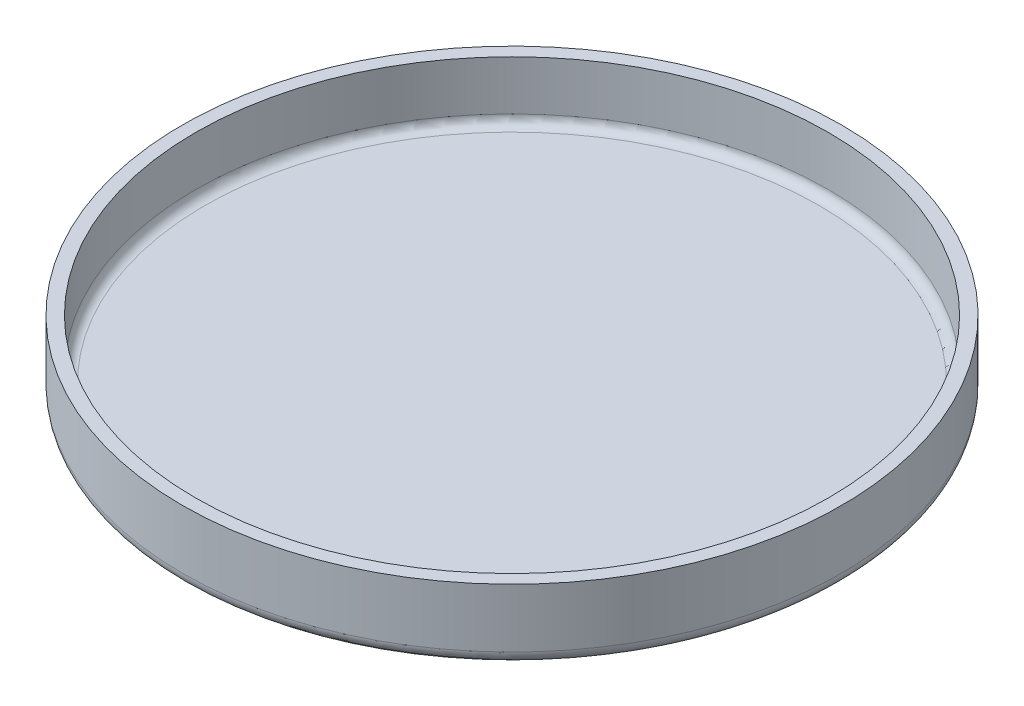
ISO-10303-21;
HEADER;
FILE_DESCRIPTION(('STEP AP214'),'2;1');
FILE_NAME('part.step','',(''),(''),'','','');
FILE_SCHEMA(('AUTOMOTIVE_DESIGN { 1 0 10303 214 1 1 1 1 }'));
ENDSEC;
DATA;
#1=APPLICATION_CONTEXT('core data for automotive mechanical design processes');
#2=APPLICATION_PROTOCOL_DEFINITION('international standard','automotive_design',2000,#1);
#3=PRODUCT_CONTEXT('',#1,'mechanical');
#4=PRODUCT('Part','Part','',(#3));
#5=PRODUCT_RELATED_PRODUCT_CATEGORY('part','',(#4));
#6=PRODUCT_DEFINITION_FORMATION('','',#4);
#7=PRODUCT_DEFINITION_CONTEXT('part definition',#1,'design');
#8=PRODUCT_DEFINITION('design','',#6,#7);
#9=PRODUCT_DEFINITION_SHAPE('','',#8);
#10=(LENGTH_UNIT() NAMED_UNIT(*) SI_UNIT(.MILLI.,.METRE.));
#11=(NAMED_UNIT(*) PLANE_ANGLE_UNIT() SI_UNIT($,.RADIAN.));
#12=(NAMED_UNIT(*) SI_UNIT($,.STERADIAN.) SOLID_ANGLE_UNIT());
#13=UNCERTAINTY_MEASURE_WITH_UNIT(LENGTH_MEASURE(1.E-05),#10,'distance_accuracy_value','');
#14=(GEOMETRIC_REPRESENTATION_CONTEXT(3) GLOBAL_UNCERTAINTY_ASSIGNED_CONTEXT((#13)) GLOBAL_UNIT_ASSIGNED_CONTEXT((#10,
#11,#12)) REPRESENTATION_CONTEXT('',''));
#15=CARTESIAN_POINT('',(0.,0.,0.));
#16=DIRECTION('',(0.,0.,1.));
#17=DIRECTION('',(1.,0.,0.));
#18=AXIS2_PLACEMENT_3D('',#15,#16,#17);
#19=CARTESIAN_POINT('',(0.,2.,0.));
#20=DIRECTION('',(0.,1.,0.));
#21=DIRECTION('',(0.,0.,1.));
#22=AXIS2_PLACEMENT_3D('',#19,#20,#21);
#23=PLANE('',#22);
#24=CARTESIAN_POINT('',(0.,1.99999999999999,0.));
#25=DIRECTION('',(0.,-1.,0.));
#26=DIRECTION('',(0.,0.,-1.));
#27=AXIS2_PLACEMENT_3D('',#24,#25,#26);
#28=CIRCLE('',#27,47.0857864376269);
#29=CARTESIAN_POINT('',(0.,1.99999999999999,-47.0857864376269));
#30=VERTEX_POINT('',#29);
#31=EDGE_CURVE('E10',#30,#30,#28,.T.);
#32=ORIENTED_EDGE('',*,*,#31,.F.);
#33=EDGE_LOOP('',(#32));
#34=FACE_BOUND('',#33,.T.);
#35=ADVANCED_FACE('F30',(#34),#23,.T.);
#36=CARTESIAN_POINT('',(0.,3.41421356237309,0.));
#37=DIRECTION('',(0.,-1.,0.));
#38=DIRECTION('',(0.,0.,-1.));
#39=AXIS2_PLACEMENT_3D('',#36,#37,#38);
#40=TOROIDAL_SURFACE('',#39,47.0857864376269,1.4142135623731);
#41=ORIENTED_EDGE('',*,*,#31,.T.);
#42=EDGE_LOOP('',(#41));
#43=FACE_BOUND('',#42,.T.);
#44=CARTESIAN_POINT('',(0.,3.41421356237309,0.));
#45=DIRECTION('',(0.,-1.,0.));
#46=DIRECTION('',(0.,0.,-1.));
#47=AXIS2_PLACEMENT_3D('',#44,#45,#46);
#48=CIRCLE('',#47,48.5);
#49=CARTESIAN_POINT('',(0.,3.41421356237309,-48.5));
#50=VERTEX_POINT('',#49);
#51=EDGE_CURVE('E36',#50,#50,#48,.T.);
#52=ORIENTED_EDGE('',*,*,#51,.F.);
#53=EDGE_LOOP('',(#52));
#54=FACE_BOUND('',#53,.T.);
#55=ADVANCED_FACE('F72',(#43,#54),#40,.F.);
#56=CARTESIAN_POINT('',(0.,0.,0.));
#57=DIRECTION('',(0.,-1.,0.));
#58=DIRECTION('',(0.,0.,-1.));
#59=AXIS2_PLACEMENT_3D('',#56,#57,#58);
#60=CYLINDRICAL_SURFACE('',#59,48.5);
#61=ORIENTED_EDGE('',*,*,#51,.T.);
#62=EDGE_LOOP('',(#61));
#63=FACE_BOUND('',#62,.T.);
#64=CARTESIAN_POINT('',(0.,11.,0.));
#65=DIRECTION('',(0.,-1.,0.));
#66=DIRECTION('',(0.,0.,-1.));
#67=AXIS2_PLACEMENT_3D('',#64,#65,#66);
#68=CIRCLE('',#67,48.5);
#69=CARTESIAN_POINT('',(0.,11.,-48.5));
#70=VERTEX_POINT('',#69);
#71=EDGE_CURVE('E40',#70,#70,#68,.T.);
#72=ORIENTED_EDGE('',*,*,#71,.F.);
#73=EDGE_LOOP('',(#72));
#74=FACE_BOUND('',#73,.T.);
#75=ADVANCED_FACE('F77',(#63,#74),#60,.F.);
#76=CARTESIAN_POINT('',(50.5,11.,0.));
#77=DIRECTION('',(0.,1.,0.));
#78=DIRECTION('',(0.,0.,1.));
#79=AXIS2_PLACEMENT_3D('',#76,#77,#78);
#80=PLANE('',#79);
#81=ORIENTED_EDGE('',*,*,#71,.T.);
#82=EDGE_LOOP('',(#81));
#83=FACE_BOUND('',#82,.T.);
#84=CARTESIAN_POINT('',(0.,11.,0.));
#85=DIRECTION('',(0.,-1.,0.));
#86=DIRECTION('',(0.,0.,-1.));
#87=AXIS2_PLACEMENT_3D('',#84,#85,#86);
#88=CIRCLE('',#87,50.5);
#89=CARTESIAN_POINT('',(0.,11.,-50.5));
#90=VERTEX_POINT('',#89);
#91=EDGE_CURVE('E44',#90,#90,#88,.T.);
#92=ORIENTED_EDGE('',*,*,#91,.F.);
#93=EDGE_LOOP('',(#92));
#94=FACE_BOUND('',#93,.T.);
#95=ADVANCED_FACE('F68',(#83,#94),#80,.T.);
#96=CARTESIAN_POINT('',(0.,0.,0.));
#97=DIRECTION('',(0.,-1.,0.));
#98=DIRECTION('',(0.,0.,-1.));
#99=AXIS2_PLACEMENT_3D('',#96,#97,#98);
#100=CYLINDRICAL_SURFACE('',#99,50.5);
#101=ORIENTED_EDGE('',*,*,#91,.T.);
#102=EDGE_LOOP('',(#101));
#103=FACE_BOUND('',#102,.T.);
#104=CARTESIAN_POINT('',(0.,2.,0.));
#105=DIRECTION('',(0.,-1.,0.));
#106=DIRECTION('',(0.,0.,-1.));
#107=AXIS2_PLACEMENT_3D('',#104,#105,#106);
#108=CIRCLE('',#107,50.5);
#109=CARTESIAN_POINT('',(0.,2.,-50.5));
#110=VERTEX_POINT('',#109);
#111=EDGE_CURVE('E49',#110,#110,#108,.T.);
#112=ORIENTED_EDGE('',*,*,#111,.F.);
#113=EDGE_LOOP('',(#112));
#114=FACE_BOUND('',#113,.T.);
#115=ADVANCED_FACE('F60',(#103,#114),#100,.T.);
#116=CARTESIAN_POINT('',(0.,1.99999999999999,0.));
#117=DIRECTION('',(0.,-1.,0.));
#118=DIRECTION('',(0.,0.,-1.));
#119=AXIS2_PLACEMENT_3D('',#116,#117,#118);
#120=TOROIDAL_SURFACE('',#119,48.5,2.);
#121=ORIENTED_EDGE('',*,*,#111,.T.);
#122=EDGE_LOOP('',(#121));
#123=FACE_BOUND('',#122,.T.);
#124=CARTESIAN_POINT('',(0.,0.,0.));
#125=DIRECTION('',(0.,-1.,0.));
#126=DIRECTION('',(0.,0.,-1.));
#127=AXIS2_PLACEMENT_3D('',#124,#125,#126);
#128=CIRCLE('',#127,48.5);
#129=CARTESIAN_POINT('',(0.,0.,-48.5));
#130=VERTEX_POINT('',#129);
#131=EDGE_CURVE('E52',#130,#130,#128,.T.);
#132=ORIENTED_EDGE('',*,*,#131,.F.);
#133=EDGE_LOOP('',(#132));
#134=FACE_BOUND('',#133,.T.);
#135=ADVANCED_FACE('F58',(#123,#134),#120,.T.);
#136=CARTESIAN_POINT('',(48.5,0.,0.));
#137=DIRECTION('',(0.,-1.,0.));
#138=DIRECTION('',(0.,0.,-1.));
#139=AXIS2_PLACEMENT_3D('',#136,#137,#138);
#140=PLANE('',#139);
#141=ORIENTED_EDGE('',*,*,#131,.T.);
#142=EDGE_LOOP('',(#141));
#143=FACE_BOUND('',#142,.T.);
#144=ADVANCED_FACE('F56',(#143),#140,.T.);
#145=CLOSED_SHELL('',(#35,#55,#75,#95,#115,#135,#144));
#146=MANIFOLD_SOLID_BREP('B2',#145);
#147=ADVANCED_BREP_SHAPE_REPRESENTATION('',(#18,#146),#14);
#148=SHAPE_DEFINITION_REPRESENTATION(#9,#147);
ENDSEC;
END-ISO-10303-21;
